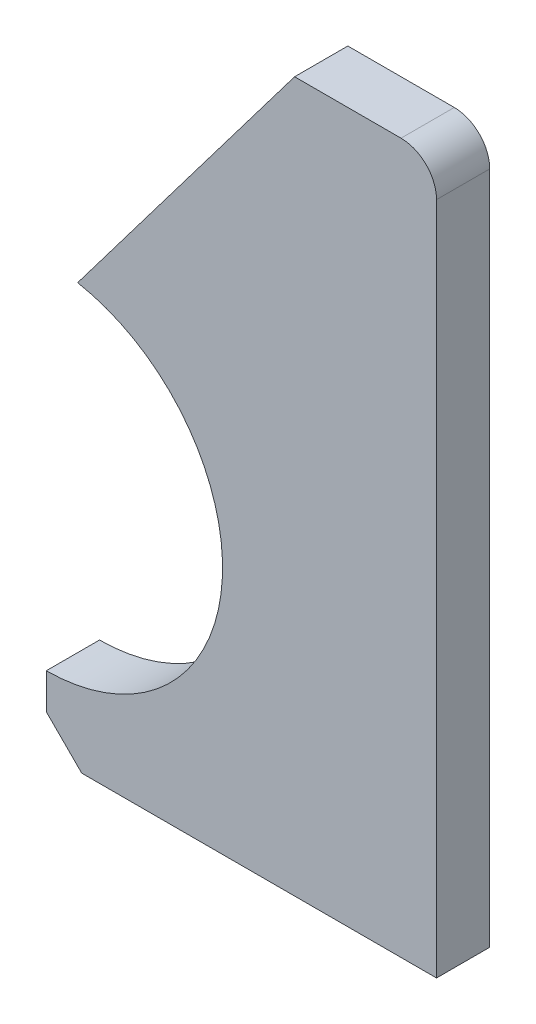
ISO-10303-21;
HEADER;
FILE_DESCRIPTION(('STEP AP214'),'2;1');
FILE_NAME('part.step','',(''),(''),'','','');
FILE_SCHEMA(('AUTOMOTIVE_DESIGN { 1 0 10303 214 1 1 1 1 }'));
ENDSEC;
DATA;
#1=APPLICATION_CONTEXT('core data for automotive mechanical design processes');
#2=APPLICATION_PROTOCOL_DEFINITION('international standard','automotive_design',2000,#1);
#3=PRODUCT_CONTEXT('',#1,'mechanical');
#4=PRODUCT('Part','Part','',(#3));
#5=PRODUCT_RELATED_PRODUCT_CATEGORY('part','',(#4));
#6=PRODUCT_DEFINITION_FORMATION('','',#4);
#7=PRODUCT_DEFINITION_CONTEXT('part definition',#1,'design');
#8=PRODUCT_DEFINITION('design','',#6,#7);
#9=PRODUCT_DEFINITION_SHAPE('','',#8);
#10=(LENGTH_UNIT() NAMED_UNIT(*) SI_UNIT(.MILLI.,.METRE.));
#11=(NAMED_UNIT(*) PLANE_ANGLE_UNIT() SI_UNIT($,.RADIAN.));
#12=(NAMED_UNIT(*) SI_UNIT($,.STERADIAN.) SOLID_ANGLE_UNIT());
#13=UNCERTAINTY_MEASURE_WITH_UNIT(LENGTH_MEASURE(1.E-05),#10,'distance_accuracy_value','');
#14=(GEOMETRIC_REPRESENTATION_CONTEXT(3) GLOBAL_UNCERTAINTY_ASSIGNED_CONTEXT((#13)) GLOBAL_UNIT_ASSIGNED_CONTEXT((#10,
#11,#12)) REPRESENTATION_CONTEXT('',''));
#15=CARTESIAN_POINT('',(0.,0.,0.));
#16=DIRECTION('',(0.,0.,1.));
#17=DIRECTION('',(1.,0.,0.));
#18=AXIS2_PLACEMENT_3D('',#15,#16,#17);
#19=CARTESIAN_POINT('',(-10.,10.,15.));
#20=DIRECTION('',(0.707106781186547,0.707106781186548,0.));
#21=DIRECTION('',(-0.707106781186548,0.707106781186547,0.));
#22=AXIS2_PLACEMENT_3D('',#19,#20,#21);
#23=PLANE('',#22);
#24=DIRECTION('',(0.707106781186548,-0.707106781186547,0.));
#25=VECTOR('',#24,1.);
#26=CARTESIAN_POINT('',(-10.,10.,0.));
#27=LINE('',#26,#25);
#28=CARTESIAN_POINT('',(-10.,10.,0.));
#29=VERTEX_POINT('',#28);
#30=CARTESIAN_POINT('',(0.,0.,0.));
#31=VERTEX_POINT('',#30);
#32=EDGE_CURVE('E135',#29,#31,#27,.T.);
#33=ORIENTED_EDGE('',*,*,#32,.T.);
#34=DIRECTION('',(0.,0.,-1.));
#35=VECTOR('',#34,1.);
#36=CARTESIAN_POINT('',(0.,0.,15.));
#37=LINE('',#36,#35);
#38=CARTESIAN_POINT('',(0.,0.,15.));
#39=VERTEX_POINT('',#38);
#40=EDGE_CURVE('E11',#39,#31,#37,.T.);
#41=ORIENTED_EDGE('',*,*,#40,.F.);
#42=DIRECTION('',(0.707106781186548,-0.707106781186547,0.));
#43=VECTOR('',#42,1.);
#44=CARTESIAN_POINT('',(-10.,10.,15.));
#45=LINE('',#44,#43);
#46=CARTESIAN_POINT('',(-10.,10.,15.));
#47=VERTEX_POINT('',#46);
#48=EDGE_CURVE('E149',#47,#39,#45,.T.);
#49=ORIENTED_EDGE('',*,*,#48,.F.);
#50=DIRECTION('',(0.,0.,-1.));
#51=VECTOR('',#50,1.);
#52=CARTESIAN_POINT('',(-10.,10.,15.));
#53=LINE('',#52,#51);
#54=EDGE_CURVE('E131',#47,#29,#53,.T.);
#55=ORIENTED_EDGE('',*,*,#54,.T.);
#56=EDGE_LOOP('',(#33,#41,#49,#55));
#57=FACE_BOUND('',#56,.T.);
#58=ADVANCED_FACE('F39',(#57),#23,.F.);
#59=CARTESIAN_POINT('',(0.,0.,15.));
#60=DIRECTION('',(0.,1.,0.));
#61=DIRECTION('',(0.,0.,1.));
#62=AXIS2_PLACEMENT_3D('',#59,#60,#61);
#63=PLANE('',#62);
#64=DIRECTION('',(1.,0.,0.));
#65=VECTOR('',#64,1.);
#66=CARTESIAN_POINT('',(0.,0.,0.));
#67=LINE('',#66,#65);
#68=CARTESIAN_POINT('',(100.,0.,0.));
#69=VERTEX_POINT('',#68);
#70=EDGE_CURVE('E138',#31,#69,#67,.T.);
#71=ORIENTED_EDGE('',*,*,#70,.T.);
#72=DIRECTION('',(0.,0.,-1.));
#73=VECTOR('',#72,1.);
#74=CARTESIAN_POINT('',(100.,0.,15.));
#75=LINE('',#74,#73);
#76=CARTESIAN_POINT('',(100.,0.,15.));
#77=VERTEX_POINT('',#76);
#78=EDGE_CURVE('E47',#77,#69,#75,.T.);
#79=ORIENTED_EDGE('',*,*,#78,.F.);
#80=DIRECTION('',(1.,0.,0.));
#81=VECTOR('',#80,1.);
#82=CARTESIAN_POINT('',(0.,0.,15.));
#83=LINE('',#82,#81);
#84=EDGE_CURVE('E98',#39,#77,#83,.T.);
#85=ORIENTED_EDGE('',*,*,#84,.F.);
#86=ORIENTED_EDGE('',*,*,#40,.T.);
#87=EDGE_LOOP('',(#71,#79,#85,#86));
#88=FACE_BOUND('',#87,.T.);
#89=ADVANCED_FACE('F184',(#88),#63,.F.);
#90=CARTESIAN_POINT('',(100.,0.,15.));
#91=DIRECTION('',(-1.,0.,0.));
#92=DIRECTION('',(0.,0.,1.));
#93=AXIS2_PLACEMENT_3D('',#90,#91,#92);
#94=PLANE('',#93);
#95=DIRECTION('',(0.,1.,0.));
#96=VECTOR('',#95,1.);
#97=CARTESIAN_POINT('',(100.,0.,0.));
#98=LINE('',#97,#96);
#99=CARTESIAN_POINT('',(100.,190.,0.));
#100=VERTEX_POINT('',#99);
#101=EDGE_CURVE('E140',#69,#100,#98,.T.);
#102=ORIENTED_EDGE('',*,*,#101,.T.);
#103=DIRECTION('',(0.,0.,-1.));
#104=VECTOR('',#103,1.);
#105=CARTESIAN_POINT('',(100.,190.,15.));
#106=LINE('',#105,#104);
#107=CARTESIAN_POINT('',(100.,190.,15.));
#108=VERTEX_POINT('',#107);
#109=EDGE_CURVE('E156',#108,#100,#106,.T.);
#110=ORIENTED_EDGE('',*,*,#109,.F.);
#111=DIRECTION('',(0.,1.,0.));
#112=VECTOR('',#111,1.);
#113=CARTESIAN_POINT('',(100.,0.,15.));
#114=LINE('',#113,#112);
#115=EDGE_CURVE('E164',#77,#108,#114,.T.);
#116=ORIENTED_EDGE('',*,*,#115,.F.);
#117=ORIENTED_EDGE('',*,*,#78,.T.);
#118=EDGE_LOOP('',(#102,#110,#116,#117));
#119=FACE_BOUND('',#118,.T.);
#120=ADVANCED_FACE('F162',(#119),#94,.F.);
#121=CARTESIAN_POINT('',(90.,190.,15.));
#122=DIRECTION('',(0.,0.,-1.));
#123=DIRECTION('',(-1.,0.,0.));
#124=AXIS2_PLACEMENT_3D('',#121,#122,#123);
#125=CYLINDRICAL_SURFACE('',#124,10.);
#126=CARTESIAN_POINT('',(90.,190.,0.));
#127=DIRECTION('',(0.,0.,1.));
#128=DIRECTION('',(-1.,0.,0.));
#129=AXIS2_PLACEMENT_3D('',#126,#127,#128);
#130=CIRCLE('',#129,10.);
#131=CARTESIAN_POINT('',(89.9999999999999,200.,0.));
#132=VERTEX_POINT('',#131);
#133=EDGE_CURVE('E142',#100,#132,#130,.T.);
#134=ORIENTED_EDGE('',*,*,#133,.T.);
#135=DIRECTION('',(0.,0.,-1.));
#136=VECTOR('',#135,1.);
#137=CARTESIAN_POINT('',(89.9999999999999,200.,15.));
#138=LINE('',#137,#136);
#139=CARTESIAN_POINT('',(89.9999999999999,200.,15.));
#140=VERTEX_POINT('',#139);
#141=EDGE_CURVE('E153',#140,#132,#138,.T.);
#142=ORIENTED_EDGE('',*,*,#141,.F.);
#143=CARTESIAN_POINT('',(90.,190.,15.));
#144=DIRECTION('',(0.,0.,1.));
#145=DIRECTION('',(-1.,0.,0.));
#146=AXIS2_PLACEMENT_3D('',#143,#144,#145);
#147=CIRCLE('',#146,10.);
#148=EDGE_CURVE('E176',#108,#140,#147,.T.);
#149=ORIENTED_EDGE('',*,*,#148,.F.);
#150=ORIENTED_EDGE('',*,*,#109,.T.);
#151=EDGE_LOOP('',(#134,#142,#149,#150));
#152=FACE_BOUND('',#151,.T.);
#153=ADVANCED_FACE('F172',(#152),#125,.T.);
#154=CARTESIAN_POINT('',(89.9999999999999,200.,15.));
#155=DIRECTION('',(0.,-1.,0.));
#156=DIRECTION('',(0.,0.,-1.));
#157=AXIS2_PLACEMENT_3D('',#154,#155,#156);
#158=PLANE('',#157);
#159=DIRECTION('',(-1.,0.,0.));
#160=VECTOR('',#159,1.);
#161=CARTESIAN_POINT('',(89.9999999999999,200.,0.));
#162=LINE('',#161,#160);
#163=CARTESIAN_POINT('',(60.,200.,0.));
#164=VERTEX_POINT('',#163);
#165=EDGE_CURVE('E144',#132,#164,#162,.T.);
#166=ORIENTED_EDGE('',*,*,#165,.T.);
#167=DIRECTION('',(0.,0.,-1.));
#168=VECTOR('',#167,1.);
#169=CARTESIAN_POINT('',(60.,200.,15.));
#170=LINE('',#169,#168);
#171=CARTESIAN_POINT('',(60.,200.,15.));
#172=VERTEX_POINT('',#171);
#173=EDGE_CURVE('E126',#172,#164,#170,.T.);
#174=ORIENTED_EDGE('',*,*,#173,.F.);
#175=DIRECTION('',(-1.,0.,0.));
#176=VECTOR('',#175,1.);
#177=CARTESIAN_POINT('',(89.9999999999999,200.,15.));
#178=LINE('',#177,#176);
#179=EDGE_CURVE('E117',#140,#172,#178,.T.);
#180=ORIENTED_EDGE('',*,*,#179,.F.);
#181=ORIENTED_EDGE('',*,*,#141,.T.);
#182=EDGE_LOOP('',(#166,#174,#180,#181));
#183=FACE_BOUND('',#182,.T.);
#184=ADVANCED_FACE('F175',(#183),#158,.F.);
#185=CARTESIAN_POINT('',(-1.14935438840793,119.153849332874,15.));
#186=DIRECTION('',(0.797555968803472,-0.603244955740167,0.));
#187=DIRECTION('',(0.603244955740167,0.797555968803472,0.));
#188=AXIS2_PLACEMENT_3D('',#185,#186,#187);
#189=PLANE('',#188);
#190=DIRECTION('',(-0.603244955740167,-0.797555968803472,0.));
#191=VECTOR('',#190,1.);
#192=CARTESIAN_POINT('',(-1.14935438840793,119.153849332874,0.));
#193=LINE('',#192,#191);
#194=CARTESIAN_POINT('',(-1.14935438840793,119.153849332874,0.));
#195=VERTEX_POINT('',#194);
#196=EDGE_CURVE('E125',#164,#195,#193,.T.);
#197=ORIENTED_EDGE('',*,*,#196,.T.);
#198=DIRECTION('',(0.,0.,-1.));
#199=VECTOR('',#198,1.);
#200=CARTESIAN_POINT('',(-1.14935438840793,119.153849332874,15.));
#201=LINE('',#200,#199);
#202=CARTESIAN_POINT('',(-1.14935438840793,119.153849332874,15.));
#203=VERTEX_POINT('',#202);
#204=EDGE_CURVE('E122',#203,#195,#201,.T.);
#205=ORIENTED_EDGE('',*,*,#204,.F.);
#206=DIRECTION('',(-0.603244955740167,-0.797555968803472,0.));
#207=VECTOR('',#206,1.);
#208=CARTESIAN_POINT('',(-1.14935438840793,119.153849332874,15.));
#209=LINE('',#208,#207);
#210=EDGE_CURVE('E111',#172,#203,#209,.T.);
#211=ORIENTED_EDGE('',*,*,#210,.F.);
#212=ORIENTED_EDGE('',*,*,#173,.T.);
#213=EDGE_LOOP('',(#197,#205,#211,#212));
#214=FACE_BOUND('',#213,.T.);
#215=ADVANCED_FACE('F123',(#214),#189,.F.);
#216=CARTESIAN_POINT('',(-10.3040373272931,69.9990756044911,15.));
#217=DIRECTION('',(0.,0.,-1.));
#218=DIRECTION('',(-1.,0.,0.));
#219=AXIS2_PLACEMENT_3D('',#216,#217,#218);
#220=CYLINDRICAL_SURFACE('',#219,50.);
#221=CARTESIAN_POINT('',(-10.3040373272931,69.9990756044911,0.));
#222=DIRECTION('',(0.,0.,-1.));
#223=DIRECTION('',(1.,0.,0.));
#224=AXIS2_PLACEMENT_3D('',#221,#222,#223);
#225=CIRCLE('',#224,50.);
#226=CARTESIAN_POINT('',(-10.,20.,0.));
#227=VERTEX_POINT('',#226);
#228=EDGE_CURVE('E84',#195,#227,#225,.T.);
#229=ORIENTED_EDGE('',*,*,#228,.T.);
#230=DIRECTION('',(0.,0.,-1.));
#231=VECTOR('',#230,1.);
#232=CARTESIAN_POINT('',(-10.,20.,15.));
#233=LINE('',#232,#231);
#234=CARTESIAN_POINT('',(-10.,20.,15.));
#235=VERTEX_POINT('',#234);
#236=EDGE_CURVE('E127',#235,#227,#233,.T.);
#237=ORIENTED_EDGE('',*,*,#236,.F.);
#238=CARTESIAN_POINT('',(-10.3040373272931,69.9990756044911,15.));
#239=DIRECTION('',(0.,0.,-1.));
#240=DIRECTION('',(1.,0.,0.));
#241=AXIS2_PLACEMENT_3D('',#238,#239,#240);
#242=CIRCLE('',#241,50.);
#243=EDGE_CURVE('E115',#203,#235,#242,.T.);
#244=ORIENTED_EDGE('',*,*,#243,.F.);
#245=ORIENTED_EDGE('',*,*,#204,.T.);
#246=EDGE_LOOP('',(#229,#237,#244,#245));
#247=FACE_BOUND('',#246,.T.);
#248=ADVANCED_FACE('F129',(#247),#220,.F.);
#249=CARTESIAN_POINT('',(-10.,10.,15.));
#250=DIRECTION('',(1.,0.,0.));
#251=DIRECTION('',(0.,0.,-1.));
#252=AXIS2_PLACEMENT_3D('',#249,#250,#251);
#253=PLANE('',#252);
#254=DIRECTION('',(0.,-1.,0.));
#255=VECTOR('',#254,1.);
#256=CARTESIAN_POINT('',(-10.,10.,0.));
#257=LINE('',#256,#255);
#258=EDGE_CURVE('E90',#227,#29,#257,.T.);
#259=ORIENTED_EDGE('',*,*,#258,.T.);
#260=ORIENTED_EDGE('',*,*,#54,.F.);
#261=DIRECTION('',(0.,-1.,0.));
#262=VECTOR('',#261,1.);
#263=CARTESIAN_POINT('',(-10.,10.,15.));
#264=LINE('',#263,#262);
#265=EDGE_CURVE('E55',#235,#47,#264,.T.);
#266=ORIENTED_EDGE('',*,*,#265,.F.);
#267=ORIENTED_EDGE('',*,*,#236,.T.);
#268=EDGE_LOOP('',(#259,#260,#266,#267));
#269=FACE_BOUND('',#268,.T.);
#270=ADVANCED_FACE('F200',(#269),#253,.F.);
#271=CARTESIAN_POINT('',(90.,190.,15.));
#272=DIRECTION('',(0.,0.,-1.));
#273=DIRECTION('',(-1.,0.,0.));
#274=AXIS2_PLACEMENT_3D('',#271,#272,#273);
#275=PLANE('',#274);
#276=ORIENTED_EDGE('',*,*,#48,.T.);
#277=ORIENTED_EDGE('',*,*,#84,.T.);
#278=ORIENTED_EDGE('',*,*,#115,.T.);
#279=ORIENTED_EDGE('',*,*,#148,.T.);
#280=ORIENTED_EDGE('',*,*,#179,.T.);
#281=ORIENTED_EDGE('',*,*,#210,.T.);
#282=ORIENTED_EDGE('',*,*,#243,.T.);
#283=ORIENTED_EDGE('',*,*,#265,.T.);
#284=EDGE_LOOP('',(#276,#277,#278,#279,#280,#281,#282,#283));
#285=FACE_BOUND('',#284,.T.);
#286=ADVANCED_FACE('F113',(#285),#275,.F.);
#287=CARTESIAN_POINT('',(90.,190.,0.));
#288=DIRECTION('',(0.,0.,-1.));
#289=DIRECTION('',(-1.,0.,0.));
#290=AXIS2_PLACEMENT_3D('',#287,#288,#289);
#291=PLANE('',#290);
#292=ORIENTED_EDGE('',*,*,#32,.F.);
#293=ORIENTED_EDGE('',*,*,#258,.F.);
#294=ORIENTED_EDGE('',*,*,#228,.F.);
#295=ORIENTED_EDGE('',*,*,#196,.F.);
#296=ORIENTED_EDGE('',*,*,#165,.F.);
#297=ORIENTED_EDGE('',*,*,#133,.F.);
#298=ORIENTED_EDGE('',*,*,#101,.F.);
#299=ORIENTED_EDGE('',*,*,#70,.F.);
#300=EDGE_LOOP('',(#292,#293,#294,#295,#296,#297,#298,#299));
#301=FACE_BOUND('',#300,.T.);
#302=ADVANCED_FACE('F168',(#301),#291,.T.);
#303=CLOSED_SHELL('',(#58,#89,#120,#153,#184,#215,#248,#270,#286,#302));
#304=MANIFOLD_SOLID_BREP('B2',#303);
#305=ADVANCED_BREP_SHAPE_REPRESENTATION('',(#18,#304),#14);
#306=SHAPE_DEFINITION_REPRESENTATION(#9,#305);
ENDSEC;
END-ISO-10303-21;
